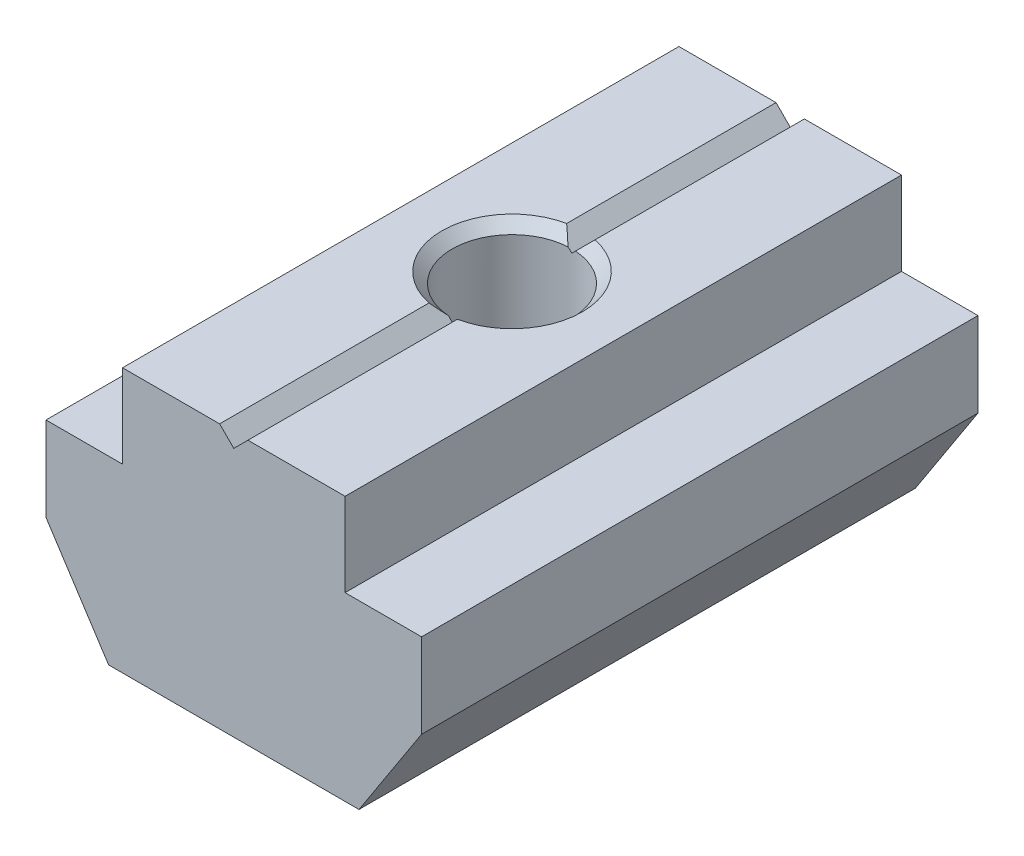
ISO-10303-21;
HEADER;
FILE_DESCRIPTION(('STEP AP214'),'2;1');
FILE_NAME('part.step','',(''),(''),'','','');
FILE_SCHEMA(('AUTOMOTIVE_DESIGN { 1 0 10303 214 1 1 1 1 }'));
ENDSEC;
DATA;
#1=APPLICATION_CONTEXT('core data for automotive mechanical design processes');
#2=APPLICATION_PROTOCOL_DEFINITION('international standard','automotive_design',2000,#1);
#3=PRODUCT_CONTEXT('',#1,'mechanical');
#4=PRODUCT('Part','Part','',(#3));
#5=PRODUCT_RELATED_PRODUCT_CATEGORY('part','',(#4));
#6=PRODUCT_DEFINITION_FORMATION('','',#4);
#7=PRODUCT_DEFINITION_CONTEXT('part definition',#1,'design');
#8=PRODUCT_DEFINITION('design','',#6,#7);
#9=PRODUCT_DEFINITION_SHAPE('','',#8);
#10=(LENGTH_UNIT() NAMED_UNIT(*) SI_UNIT(.MILLI.,.METRE.));
#11=(NAMED_UNIT(*) PLANE_ANGLE_UNIT() SI_UNIT($,.RADIAN.));
#12=(NAMED_UNIT(*) SI_UNIT($,.STERADIAN.) SOLID_ANGLE_UNIT());
#13=UNCERTAINTY_MEASURE_WITH_UNIT(LENGTH_MEASURE(1.E-05),#10,'distance_accuracy_value','');
#14=(GEOMETRIC_REPRESENTATION_CONTEXT(3) GLOBAL_UNCERTAINTY_ASSIGNED_CONTEXT((#13)) GLOBAL_UNIT_ASSIGNED_CONTEXT((#10,
#11,#12)) REPRESENTATION_CONTEXT('',''));
#15=CARTESIAN_POINT('',(0.,0.,0.));
#16=DIRECTION('',(0.,0.,1.));
#17=DIRECTION('',(1.,0.,0.));
#18=AXIS2_PLACEMENT_3D('',#15,#16,#17);
#19=CARTESIAN_POINT('',(4.,9.5,-10.));
#20=DIRECTION('',(0.,1.,0.));
#21=DIRECTION('',(-1.,0.,0.));
#22=AXIS2_PLACEMENT_3D('',#19,#20,#21);
#23=PLANE('',#22);
#24=DIRECTION('',(0.,0.,1.));
#25=VECTOR('',#24,1.);
#26=CARTESIAN_POINT('',(0.509116882454315,9.5,-10.));
#27=LINE('',#26,#25);
#28=CARTESIAN_POINT('',(0.509116882454315,9.5,-10.));
#29=VERTEX_POINT('',#28);
#30=CARTESIAN_POINT('',(0.509116882454315,9.5,-2.47314071577013));
#31=VERTEX_POINT('',#30);
#32=EDGE_CURVE('E236',#29,#31,#27,.T.);
#33=ORIENTED_EDGE('',*,*,#32,.T.);
#34=CARTESIAN_POINT('',(0.,9.5,0.));
#35=DIRECTION('',(0.,1.,0.));
#36=DIRECTION('',(-1.,0.,0.));
#37=AXIS2_PLACEMENT_3D('',#34,#35,#36);
#38=CIRCLE('',#37,2.525);
#39=CARTESIAN_POINT('',(0.509116882454315,9.5,2.47314071577013));
#40=VERTEX_POINT('',#39);
#41=EDGE_CURVE('E333',#31,#40,#38,.F.);
#42=ORIENTED_EDGE('',*,*,#41,.T.);
#43=CARTESIAN_POINT('',(0.509116882454315,9.5,10.));
#44=VERTEX_POINT('',#43);
#45=EDGE_CURVE('E391',#40,#44,#27,.T.);
#46=ORIENTED_EDGE('',*,*,#45,.T.);
#47=DIRECTION('',(-1.,0.,0.));
#48=VECTOR('',#47,1.);
#49=CARTESIAN_POINT('',(4.,9.5,10.));
#50=LINE('',#49,#48);
#51=CARTESIAN_POINT('',(4.,9.5,10.));
#52=VERTEX_POINT('',#51);
#53=EDGE_CURVE('E249',#52,#44,#50,.T.);
#54=ORIENTED_EDGE('',*,*,#53,.F.);
#55=DIRECTION('',(0.,0.,1.));
#56=VECTOR('',#55,1.);
#57=CARTESIAN_POINT('',(4.,9.5,-10.));
#58=LINE('',#57,#56);
#59=CARTESIAN_POINT('',(4.,9.5,-10.));
#60=VERTEX_POINT('',#59);
#61=EDGE_CURVE('E293',#60,#52,#58,.T.);
#62=ORIENTED_EDGE('',*,*,#61,.F.);
#63=DIRECTION('',(-1.,0.,0.));
#64=VECTOR('',#63,1.);
#65=CARTESIAN_POINT('',(4.,9.5,-10.));
#66=LINE('',#65,#64);
#67=EDGE_CURVE('E200',#60,#29,#66,.T.);
#68=ORIENTED_EDGE('',*,*,#67,.T.);
#69=EDGE_LOOP('',(#33,#42,#46,#54,#62,#68));
#70=FACE_BOUND('',#69,.T.);
#71=ADVANCED_FACE('F45',(#70),#23,.T.);
#72=CARTESIAN_POINT('',(4.5,0.,-10.));
#73=DIRECTION('',(0.838670567945425,-0.544639035015025,0.));
#74=DIRECTION('',(0.544639035015025,0.838670567945425,0.));
#75=AXIS2_PLACEMENT_3D('',#72,#73,#74);
#76=PLANE('',#75);
#77=DIRECTION('',(0.544639035015025,0.838670567945425,0.));
#78=VECTOR('',#77,1.);
#79=CARTESIAN_POINT('',(4.5,0.,10.));
#80=LINE('',#79,#78);
#81=CARTESIAN_POINT('',(4.5,0.,10.));
#82=VERTEX_POINT('',#81);
#83=CARTESIAN_POINT('',(6.75,3.46469616858283,10.));
#84=VERTEX_POINT('',#83);
#85=EDGE_CURVE('E231',#82,#84,#80,.T.);
#86=ORIENTED_EDGE('',*,*,#85,.F.);
#87=DIRECTION('',(0.,0.,1.));
#88=VECTOR('',#87,1.);
#89=CARTESIAN_POINT('',(4.5,0.,-10.));
#90=LINE('',#89,#88);
#91=CARTESIAN_POINT('',(4.5,0.,-10.));
#92=VERTEX_POINT('',#91);
#93=EDGE_CURVE('E274',#92,#82,#90,.T.);
#94=ORIENTED_EDGE('',*,*,#93,.F.);
#95=DIRECTION('',(0.544639035015025,0.838670567945425,0.));
#96=VECTOR('',#95,1.);
#97=CARTESIAN_POINT('',(4.5,0.,-10.));
#98=LINE('',#97,#96);
#99=CARTESIAN_POINT('',(6.75,3.46469616858283,-10.));
#100=VERTEX_POINT('',#99);
#101=EDGE_CURVE('E273',#92,#100,#98,.T.);
#102=ORIENTED_EDGE('',*,*,#101,.T.);
#103=DIRECTION('',(0.,0.,1.));
#104=VECTOR('',#103,1.);
#105=CARTESIAN_POINT('',(6.75,3.46469616858283,-10.));
#106=LINE('',#105,#104);
#107=EDGE_CURVE('E230',#100,#84,#106,.T.);
#108=ORIENTED_EDGE('',*,*,#107,.T.);
#109=EDGE_LOOP('',(#86,#94,#102,#108));
#110=FACE_BOUND('',#109,.T.);
#111=ADVANCED_FACE('F412',(#110),#76,.T.);
#112=CARTESIAN_POINT('',(-4.5,0.,-10.));
#113=DIRECTION('',(0.,-1.,0.));
#114=DIRECTION('',(0.,0.,-1.));
#115=AXIS2_PLACEMENT_3D('',#112,#113,#114);
#116=PLANE('',#115);
#117=CARTESIAN_POINT('',(0.,0.,0.));
#118=DIRECTION('',(0.,-1.,0.));
#119=DIRECTION('',(0.,0.,-1.));
#120=AXIS2_PLACEMENT_3D('',#117,#118,#119);
#121=CIRCLE('',#120,2.525);
#122=CARTESIAN_POINT('',(0.,0.,-2.525));
#123=VERTEX_POINT('',#122);
#124=EDGE_CURVE('E11',#123,#123,#121,.F.);
#125=ORIENTED_EDGE('',*,*,#124,.T.);
#126=EDGE_LOOP('',(#125));
#127=FACE_BOUND('',#126,.T.);
#128=DIRECTION('',(1.,0.,0.));
#129=VECTOR('',#128,1.);
#130=CARTESIAN_POINT('',(-4.5,0.,10.));
#131=LINE('',#130,#129);
#132=CARTESIAN_POINT('',(-4.5,0.,10.));
#133=VERTEX_POINT('',#132);
#134=EDGE_CURVE('E269',#133,#82,#131,.T.);
#135=ORIENTED_EDGE('',*,*,#134,.F.);
#136=DIRECTION('',(0.,0.,1.));
#137=VECTOR('',#136,1.);
#138=CARTESIAN_POINT('',(-4.5,0.,-10.));
#139=LINE('',#138,#137);
#140=CARTESIAN_POINT('',(-4.5,0.,-10.));
#141=VERTEX_POINT('',#140);
#142=EDGE_CURVE('E278',#141,#133,#139,.T.);
#143=ORIENTED_EDGE('',*,*,#142,.F.);
#144=DIRECTION('',(1.,0.,0.));
#145=VECTOR('',#144,1.);
#146=CARTESIAN_POINT('',(-4.5,0.,-10.));
#147=LINE('',#146,#145);
#148=EDGE_CURVE('E226',#141,#92,#147,.T.);
#149=ORIENTED_EDGE('',*,*,#148,.T.);
#150=ORIENTED_EDGE('',*,*,#93,.T.);
#151=EDGE_LOOP('',(#135,#143,#149,#150));
#152=FACE_BOUND('',#151,.T.);
#153=ADVANCED_FACE('F417',(#127,#152),#116,.T.);
#154=CARTESIAN_POINT('',(-6.75,3.46469616858283,-10.));
#155=DIRECTION('',(-0.838670567945425,-0.544639035015025,0.));
#156=DIRECTION('',(0.544639035015025,-0.838670567945425,0.));
#157=AXIS2_PLACEMENT_3D('',#154,#155,#156);
#158=PLANE('',#157);
#159=DIRECTION('',(0.544639035015025,-0.838670567945425,0.));
#160=VECTOR('',#159,1.);
#161=CARTESIAN_POINT('',(-6.75,3.46469616858283,10.));
#162=LINE('',#161,#160);
#163=CARTESIAN_POINT('',(-6.75,3.46469616858283,10.));
#164=VERTEX_POINT('',#163);
#165=EDGE_CURVE('E265',#164,#133,#162,.T.);
#166=ORIENTED_EDGE('',*,*,#165,.F.);
#167=DIRECTION('',(0.,0.,1.));
#168=VECTOR('',#167,1.);
#169=CARTESIAN_POINT('',(-6.75,3.46469616858283,-10.));
#170=LINE('',#169,#168);
#171=CARTESIAN_POINT('',(-6.75,3.46469616858283,-10.));
#172=VERTEX_POINT('',#171);
#173=EDGE_CURVE('E281',#172,#164,#170,.T.);
#174=ORIENTED_EDGE('',*,*,#173,.F.);
#175=DIRECTION('',(0.544639035015025,-0.838670567945425,0.));
#176=VECTOR('',#175,1.);
#177=CARTESIAN_POINT('',(-6.75,3.46469616858283,-10.));
#178=LINE('',#177,#176);
#179=EDGE_CURVE('E222',#172,#141,#178,.T.);
#180=ORIENTED_EDGE('',*,*,#179,.T.);
#181=ORIENTED_EDGE('',*,*,#142,.T.);
#182=EDGE_LOOP('',(#166,#174,#180,#181));
#183=FACE_BOUND('',#182,.T.);
#184=ADVANCED_FACE('F420',(#183),#158,.T.);
#185=CARTESIAN_POINT('',(-6.75,6.5,-10.));
#186=DIRECTION('',(-1.,0.,0.));
#187=DIRECTION('',(0.,0.,1.));
#188=AXIS2_PLACEMENT_3D('',#185,#186,#187);
#189=PLANE('',#188);
#190=DIRECTION('',(0.,-1.,0.));
#191=VECTOR('',#190,1.);
#192=CARTESIAN_POINT('',(-6.75,6.5,10.));
#193=LINE('',#192,#191);
#194=CARTESIAN_POINT('',(-6.75,6.5,10.));
#195=VERTEX_POINT('',#194);
#196=EDGE_CURVE('E261',#195,#164,#193,.T.);
#197=ORIENTED_EDGE('',*,*,#196,.F.);
#198=DIRECTION('',(0.,0.,1.));
#199=VECTOR('',#198,1.);
#200=CARTESIAN_POINT('',(-6.75,6.5,-10.));
#201=LINE('',#200,#199);
#202=CARTESIAN_POINT('',(-6.75,6.5,-10.));
#203=VERTEX_POINT('',#202);
#204=EDGE_CURVE('E284',#203,#195,#201,.T.);
#205=ORIENTED_EDGE('',*,*,#204,.F.);
#206=DIRECTION('',(0.,-1.,0.));
#207=VECTOR('',#206,1.);
#208=CARTESIAN_POINT('',(-6.75,6.5,-10.));
#209=LINE('',#208,#207);
#210=EDGE_CURVE('E218',#203,#172,#209,.T.);
#211=ORIENTED_EDGE('',*,*,#210,.T.);
#212=ORIENTED_EDGE('',*,*,#173,.T.);
#213=EDGE_LOOP('',(#197,#205,#211,#212));
#214=FACE_BOUND('',#213,.T.);
#215=ADVANCED_FACE('F424',(#214),#189,.T.);
#216=CARTESIAN_POINT('',(-4.,6.5,-10.));
#217=DIRECTION('',(0.,1.,0.));
#218=DIRECTION('',(-1.,0.,0.));
#219=AXIS2_PLACEMENT_3D('',#216,#217,#218);
#220=PLANE('',#219);
#221=DIRECTION('',(-1.,0.,0.));
#222=VECTOR('',#221,1.);
#223=CARTESIAN_POINT('',(-4.,6.5,10.));
#224=LINE('',#223,#222);
#225=CARTESIAN_POINT('',(-4.,6.5,10.));
#226=VERTEX_POINT('',#225);
#227=EDGE_CURVE('E257',#226,#195,#224,.T.);
#228=ORIENTED_EDGE('',*,*,#227,.F.);
#229=DIRECTION('',(0.,0.,1.));
#230=VECTOR('',#229,1.);
#231=CARTESIAN_POINT('',(-4.,6.5,-10.));
#232=LINE('',#231,#230);
#233=CARTESIAN_POINT('',(-4.,6.5,-10.));
#234=VERTEX_POINT('',#233);
#235=EDGE_CURVE('E287',#234,#226,#232,.T.);
#236=ORIENTED_EDGE('',*,*,#235,.F.);
#237=DIRECTION('',(-1.,0.,0.));
#238=VECTOR('',#237,1.);
#239=CARTESIAN_POINT('',(-4.,6.5,-10.));
#240=LINE('',#239,#238);
#241=EDGE_CURVE('E214',#234,#203,#240,.T.);
#242=ORIENTED_EDGE('',*,*,#241,.T.);
#243=ORIENTED_EDGE('',*,*,#204,.T.);
#244=EDGE_LOOP('',(#228,#236,#242,#243));
#245=FACE_BOUND('',#244,.T.);
#246=ADVANCED_FACE('F427',(#245),#220,.T.);
#247=CARTESIAN_POINT('',(-4.,9.5,-10.));
#248=DIRECTION('',(-1.,0.,0.));
#249=DIRECTION('',(0.,0.,1.));
#250=AXIS2_PLACEMENT_3D('',#247,#248,#249);
#251=PLANE('',#250);
#252=DIRECTION('',(0.,-1.,0.));
#253=VECTOR('',#252,1.);
#254=CARTESIAN_POINT('',(-4.,9.5,10.));
#255=LINE('',#254,#253);
#256=CARTESIAN_POINT('',(-4.,9.5,10.));
#257=VERTEX_POINT('',#256);
#258=EDGE_CURVE('E253',#257,#226,#255,.T.);
#259=ORIENTED_EDGE('',*,*,#258,.F.);
#260=DIRECTION('',(0.,0.,1.));
#261=VECTOR('',#260,1.);
#262=CARTESIAN_POINT('',(-4.,9.5,-10.));
#263=LINE('',#262,#261);
#264=CARTESIAN_POINT('',(-4.,9.5,-10.));
#265=VERTEX_POINT('',#264);
#266=EDGE_CURVE('E290',#265,#257,#263,.T.);
#267=ORIENTED_EDGE('',*,*,#266,.F.);
#268=DIRECTION('',(0.,-1.,0.));
#269=VECTOR('',#268,1.);
#270=CARTESIAN_POINT('',(-4.,9.5,-10.));
#271=LINE('',#270,#269);
#272=EDGE_CURVE('E198',#265,#234,#271,.T.);
#273=ORIENTED_EDGE('',*,*,#272,.T.);
#274=ORIENTED_EDGE('',*,*,#235,.T.);
#275=EDGE_LOOP('',(#259,#267,#273,#274));
#276=FACE_BOUND('',#275,.T.);
#277=ADVANCED_FACE('F430',(#276),#251,.T.);
#278=DIRECTION('',(0.,0.,1.));
#279=VECTOR('',#278,1.);
#280=CARTESIAN_POINT('',(-0.509116882454313,9.5,-10.));
#281=LINE('',#280,#279);
#282=CARTESIAN_POINT('',(-0.509116882454313,9.5,2.47314071577013));
#283=VERTEX_POINT('',#282);
#284=CARTESIAN_POINT('',(-0.509116882454313,9.5,10.));
#285=VERTEX_POINT('',#284);
#286=EDGE_CURVE('E192',#283,#285,#281,.T.);
#287=ORIENTED_EDGE('',*,*,#286,.F.);
#288=CARTESIAN_POINT('',(0.,9.5,0.));
#289=DIRECTION('',(0.,1.,0.));
#290=DIRECTION('',(-1.,0.,0.));
#291=AXIS2_PLACEMENT_3D('',#288,#289,#290);
#292=CIRCLE('',#291,2.525);
#293=CARTESIAN_POINT('',(-0.509116882454313,9.5,-2.47314071577013));
#294=VERTEX_POINT('',#293);
#295=EDGE_CURVE('E61',#283,#294,#292,.F.);
#296=ORIENTED_EDGE('',*,*,#295,.T.);
#297=CARTESIAN_POINT('',(-0.509116882454313,9.5,-10.));
#298=VERTEX_POINT('',#297);
#299=EDGE_CURVE('E173',#298,#294,#281,.T.);
#300=ORIENTED_EDGE('',*,*,#299,.F.);
#301=EDGE_CURVE('E188',#298,#265,#66,.T.);
#302=ORIENTED_EDGE('',*,*,#301,.T.);
#303=ORIENTED_EDGE('',*,*,#266,.T.);
#304=EDGE_CURVE('E248',#285,#257,#50,.T.);
#305=ORIENTED_EDGE('',*,*,#304,.F.);
#306=EDGE_LOOP('',(#287,#296,#300,#302,#303,#305));
#307=FACE_BOUND('',#306,.T.);
#308=ADVANCED_FACE('F186',(#307),#23,.T.);
#309=CARTESIAN_POINT('',(4.,6.5,-10.));
#310=DIRECTION('',(1.,0.,0.));
#311=DIRECTION('',(0.,0.,-1.));
#312=AXIS2_PLACEMENT_3D('',#309,#310,#311);
#313=PLANE('',#312);
#314=DIRECTION('',(0.,1.,0.));
#315=VECTOR('',#314,1.);
#316=CARTESIAN_POINT('',(4.,6.5,10.));
#317=LINE('',#316,#315);
#318=CARTESIAN_POINT('',(4.,6.5,10.));
#319=VERTEX_POINT('',#318);
#320=EDGE_CURVE('E244',#319,#52,#317,.T.);
#321=ORIENTED_EDGE('',*,*,#320,.F.);
#322=DIRECTION('',(0.,0.,1.));
#323=VECTOR('',#322,1.);
#324=CARTESIAN_POINT('',(4.,6.5,-10.));
#325=LINE('',#324,#323);
#326=CARTESIAN_POINT('',(4.,6.5,-10.));
#327=VERTEX_POINT('',#326);
#328=EDGE_CURVE('E296',#327,#319,#325,.T.);
#329=ORIENTED_EDGE('',*,*,#328,.F.);
#330=DIRECTION('',(0.,1.,0.));
#331=VECTOR('',#330,1.);
#332=CARTESIAN_POINT('',(4.,6.5,-10.));
#333=LINE('',#332,#331);
#334=EDGE_CURVE('E201',#327,#60,#333,.T.);
#335=ORIENTED_EDGE('',*,*,#334,.T.);
#336=ORIENTED_EDGE('',*,*,#61,.T.);
#337=EDGE_LOOP('',(#321,#329,#335,#336));
#338=FACE_BOUND('',#337,.T.);
#339=ADVANCED_FACE('F455',(#338),#313,.T.);
#340=CARTESIAN_POINT('',(6.75,6.5,-10.));
#341=DIRECTION('',(0.,1.,0.));
#342=DIRECTION('',(-1.,0.,0.));
#343=AXIS2_PLACEMENT_3D('',#340,#341,#342);
#344=PLANE('',#343);
#345=DIRECTION('',(-1.,0.,0.));
#346=VECTOR('',#345,1.);
#347=CARTESIAN_POINT('',(6.75,6.5,10.));
#348=LINE('',#347,#346);
#349=CARTESIAN_POINT('',(6.75,6.5,10.));
#350=VERTEX_POINT('',#349);
#351=EDGE_CURVE('E240',#350,#319,#348,.T.);
#352=ORIENTED_EDGE('',*,*,#351,.F.);
#353=DIRECTION('',(0.,0.,1.));
#354=VECTOR('',#353,1.);
#355=CARTESIAN_POINT('',(6.75,6.5,-10.));
#356=LINE('',#355,#354);
#357=CARTESIAN_POINT('',(6.75,6.5,-10.));
#358=VERTEX_POINT('',#357);
#359=EDGE_CURVE('E299',#358,#350,#356,.T.);
#360=ORIENTED_EDGE('',*,*,#359,.F.);
#361=DIRECTION('',(-1.,0.,0.));
#362=VECTOR('',#361,1.);
#363=CARTESIAN_POINT('',(6.75,6.5,-10.));
#364=LINE('',#363,#362);
#365=EDGE_CURVE('E208',#358,#327,#364,.T.);
#366=ORIENTED_EDGE('',*,*,#365,.T.);
#367=ORIENTED_EDGE('',*,*,#328,.T.);
#368=EDGE_LOOP('',(#352,#360,#366,#367));
#369=FACE_BOUND('',#368,.T.);
#370=ADVANCED_FACE('F401',(#369),#344,.T.);
#371=CARTESIAN_POINT('',(6.75,3.46469616858283,-10.));
#372=DIRECTION('',(1.,0.,0.));
#373=DIRECTION('',(0.,0.,-1.));
#374=AXIS2_PLACEMENT_3D('',#371,#372,#373);
#375=PLANE('',#374);
#376=DIRECTION('',(0.,1.,0.));
#377=VECTOR('',#376,1.);
#378=CARTESIAN_POINT('',(6.75,3.46469616858283,10.));
#379=LINE('',#378,#377);
#380=EDGE_CURVE('E235',#84,#350,#379,.T.);
#381=ORIENTED_EDGE('',*,*,#380,.F.);
#382=ORIENTED_EDGE('',*,*,#107,.F.);
#383=DIRECTION('',(0.,1.,0.));
#384=VECTOR('',#383,1.);
#385=CARTESIAN_POINT('',(6.75,3.46469616858283,-10.));
#386=LINE('',#385,#384);
#387=EDGE_CURVE('E375',#100,#358,#386,.T.);
#388=ORIENTED_EDGE('',*,*,#387,.T.);
#389=ORIENTED_EDGE('',*,*,#359,.T.);
#390=EDGE_LOOP('',(#381,#382,#388,#389));
#391=FACE_BOUND('',#390,.T.);
#392=ADVANCED_FACE('F409',(#391),#375,.T.);
#393=CARTESIAN_POINT('',(0.,0.,-10.));
#394=DIRECTION('',(0.,0.,-1.));
#395=DIRECTION('',(-1.,0.,0.));
#396=AXIS2_PLACEMENT_3D('',#393,#394,#395);
#397=PLANE('',#396);
#398=DIRECTION('',(0.707106781186547,0.707106781186548,0.));
#399=VECTOR('',#398,1.);
#400=CARTESIAN_POINT('',(0.,8.99088311754569,-10.));
#401=LINE('',#400,#399);
#402=CARTESIAN_POINT('',(0.,8.99088311754569,-10.));
#403=VERTEX_POINT('',#402);
#404=EDGE_CURVE('E183',#403,#29,#401,.T.);
#405=ORIENTED_EDGE('',*,*,#404,.T.);
#406=ORIENTED_EDGE('',*,*,#67,.F.);
#407=ORIENTED_EDGE('',*,*,#334,.F.);
#408=ORIENTED_EDGE('',*,*,#365,.F.);
#409=ORIENTED_EDGE('',*,*,#387,.F.);
#410=ORIENTED_EDGE('',*,*,#101,.F.);
#411=ORIENTED_EDGE('',*,*,#148,.F.);
#412=ORIENTED_EDGE('',*,*,#179,.F.);
#413=ORIENTED_EDGE('',*,*,#210,.F.);
#414=ORIENTED_EDGE('',*,*,#241,.F.);
#415=ORIENTED_EDGE('',*,*,#272,.F.);
#416=ORIENTED_EDGE('',*,*,#301,.F.);
#417=DIRECTION('',(0.707106781186547,-0.707106781186548,0.));
#418=VECTOR('',#417,1.);
#419=CARTESIAN_POINT('',(-0.509116882454313,9.5,-10.));
#420=LINE('',#419,#418);
#421=EDGE_CURVE('E171',#298,#403,#420,.T.);
#422=ORIENTED_EDGE('',*,*,#421,.T.);
#423=EDGE_LOOP('',(#405,#406,#407,#408,#409,#410,#411,#412,#413,#414,#415,#416,#422));
#424=FACE_BOUND('',#423,.T.);
#425=ADVANCED_FACE('F195',(#424),#397,.T.);
#426=CARTESIAN_POINT('',(0.,0.,10.));
#427=DIRECTION('',(0.,0.,-1.));
#428=DIRECTION('',(-1.,0.,0.));
#429=AXIS2_PLACEMENT_3D('',#426,#427,#428);
#430=PLANE('',#429);
#431=ORIENTED_EDGE('',*,*,#53,.T.);
#432=DIRECTION('',(0.707106781186547,0.707106781186548,0.));
#433=VECTOR('',#432,1.);
#434=CARTESIAN_POINT('',(0.,8.99088311754569,10.));
#435=LINE('',#434,#433);
#436=CARTESIAN_POINT('',(0.,8.99088311754569,10.));
#437=VERTEX_POINT('',#436);
#438=EDGE_CURVE('E184',#437,#44,#435,.T.);
#439=ORIENTED_EDGE('',*,*,#438,.F.);
#440=DIRECTION('',(0.707106781186547,-0.707106781186548,0.));
#441=VECTOR('',#440,1.);
#442=CARTESIAN_POINT('',(-0.509116882454313,9.5,10.));
#443=LINE('',#442,#441);
#444=EDGE_CURVE('E377',#285,#437,#443,.T.);
#445=ORIENTED_EDGE('',*,*,#444,.F.);
#446=ORIENTED_EDGE('',*,*,#304,.T.);
#447=ORIENTED_EDGE('',*,*,#258,.T.);
#448=ORIENTED_EDGE('',*,*,#227,.T.);
#449=ORIENTED_EDGE('',*,*,#196,.T.);
#450=ORIENTED_EDGE('',*,*,#165,.T.);
#451=ORIENTED_EDGE('',*,*,#134,.T.);
#452=ORIENTED_EDGE('',*,*,#85,.T.);
#453=ORIENTED_EDGE('',*,*,#380,.T.);
#454=ORIENTED_EDGE('',*,*,#351,.T.);
#455=ORIENTED_EDGE('',*,*,#320,.T.);
#456=EDGE_LOOP('',(#431,#439,#445,#446,#447,#448,#449,#450,#451,#452,#453,#454,#455));
#457=FACE_BOUND('',#456,.T.);
#458=ADVANCED_FACE('F439',(#457),#430,.F.);
#459=CARTESIAN_POINT('',(0.,0.,0.));
#460=DIRECTION('',(0.,1.,0.));
#461=DIRECTION('',(-1.,0.,0.));
#462=AXIS2_PLACEMENT_3D('',#459,#460,#461);
#463=CYLINDRICAL_SURFACE('',#462,2.15);
#464=CARTESIAN_POINT('',(0.,0.374999999999996,0.));
#465=DIRECTION('',(0.,-1.,0.));
#466=DIRECTION('',(1.,0.,0.));
#467=AXIS2_PLACEMENT_3D('',#464,#465,#466);
#468=CIRCLE('',#467,2.15);
#469=CARTESIAN_POINT('',(2.15,0.374999999999997,0.));
#470=VERTEX_POINT('',#469);
#471=EDGE_CURVE('E312',#470,#470,#468,.T.);
#472=ORIENTED_EDGE('',*,*,#471,.T.);
#473=EDGE_LOOP('',(#472));
#474=FACE_BOUND('',#473,.T.);
#475=CARTESIAN_POINT('',(0.,8.99088311754568,0.));
#476=DIRECTION('',(0.707106781186548,-0.707106781186547,0.));
#477=DIRECTION('',(0.707106781186547,0.707106781186548,0.));
#478=AXIS2_PLACEMENT_3D('',#475,#476,#477);
#479=ELLIPSE('',#478,3.04055915910216,2.15);
#480=CARTESIAN_POINT('',(0.,8.99088311754569,2.15));
#481=VERTEX_POINT('',#480);
#482=CARTESIAN_POINT('',(0.134116882454314,9.125,2.14581282078394));
#483=VERTEX_POINT('',#482);
#484=EDGE_CURVE('E311',#481,#483,#479,.F.);
#485=ORIENTED_EDGE('',*,*,#484,.T.);
#486=CARTESIAN_POINT('',(0.,9.125,0.));
#487=DIRECTION('',(0.,1.,0.));
#488=DIRECTION('',(-1.,0.,0.));
#489=AXIS2_PLACEMENT_3D('',#486,#487,#488);
#490=CIRCLE('',#489,2.15);
#491=CARTESIAN_POINT('',(0.134116882454314,9.125,-2.14581282078394));
#492=VERTEX_POINT('',#491);
#493=EDGE_CURVE('E320',#483,#492,#490,.T.);
#494=ORIENTED_EDGE('',*,*,#493,.T.);
#495=CARTESIAN_POINT('',(0.,8.99088311754569,-2.15));
#496=VERTEX_POINT('',#495);
#497=EDGE_CURVE('E307',#492,#496,#479,.F.);
#498=ORIENTED_EDGE('',*,*,#497,.T.);
#499=CARTESIAN_POINT('',(0.,8.99088311754569,0.));
#500=DIRECTION('',(-0.707106781186548,-0.707106781186547,0.));
#501=DIRECTION('',(-0.707106781186547,0.707106781186548,0.));
#502=AXIS2_PLACEMENT_3D('',#499,#500,#501);
#503=ELLIPSE('',#502,3.04055915910216,2.15);
#504=CARTESIAN_POINT('',(-0.134116882454313,9.125,-2.14581282078394));
#505=VERTEX_POINT('',#504);
#506=EDGE_CURVE('E277',#496,#505,#503,.F.);
#507=ORIENTED_EDGE('',*,*,#506,.T.);
#508=CARTESIAN_POINT('',(0.,9.125,0.));
#509=DIRECTION('',(0.,1.,0.));
#510=DIRECTION('',(-1.,0.,0.));
#511=AXIS2_PLACEMENT_3D('',#508,#509,#510);
#512=CIRCLE('',#511,2.15);
#513=CARTESIAN_POINT('',(-0.134116882454313,9.125,2.14581282078394));
#514=VERTEX_POINT('',#513);
#515=EDGE_CURVE('E316',#505,#514,#512,.T.);
#516=ORIENTED_EDGE('',*,*,#515,.T.);
#517=EDGE_CURVE('E308',#514,#481,#503,.F.);
#518=ORIENTED_EDGE('',*,*,#517,.T.);
#519=EDGE_LOOP('',(#485,#494,#498,#507,#516,#518));
#520=FACE_BOUND('',#519,.T.);
#521=ADVANCED_FACE('F449',(#474,#520),#463,.F.);
#522=CARTESIAN_POINT('',(-0.509116882454313,9.5,-10.));
#523=DIRECTION('',(-0.707106781186548,-0.707106781186547,0.));
#524=DIRECTION('',(0.707106781186547,-0.707106781186548,0.));
#525=AXIS2_PLACEMENT_3D('',#522,#523,#524);
#526=PLANE('',#525);
#527=ORIENTED_EDGE('',*,*,#299,.T.);
#528=CARTESIAN_POINT('',(-0.509116882454313,9.5,-2.47314071577013));
#529=CARTESIAN_POINT('',(-0.477292390154802,9.46817550770049,-2.44719908113499));
#530=CARTESIAN_POINT('',(-0.445591551700827,9.43647466924652,-2.42095239021074));
#531=CARTESIAN_POINT('',(-0.382473047894031,9.37335616543972,-2.36781204005094));
#532=CARTESIAN_POINT('',(-0.351055313579388,9.34193843112508,-2.34091854456794));
#533=CARTESIAN_POINT('',(-0.288521347638149,9.27940446518384,-2.2864334140952));
#534=CARTESIAN_POINT('',(-0.257405131131995,9.24828824867768,-2.25884174434159));
#535=CARTESIAN_POINT('',(-0.195502732414762,9.18638584996045,-2.20290412980677));
#536=CARTESIAN_POINT('',(-0.164716634909191,9.15559975245488,-2.174557997641));
#537=CARTESIAN_POINT('',(-0.134116882454313,9.125,-2.14581282078394));
#538=B_SPLINE_CURVE_WITH_KNOTS('',3,(#528,#529,#530,#531,#532,#533,#534,#535,#536,#537),
.UNSPECIFIED.,.F.,.F.,(4,2,2,2,4),(0.,0.155843143997325,0.311647239844359,0.467459108897528,
0.623310044602721),.UNSPECIFIED.);
#539=EDGE_CURVE('E54',#294,#505,#538,.T.);
#540=ORIENTED_EDGE('',*,*,#539,.T.);
#541=ORIENTED_EDGE('',*,*,#506,.F.);
#542=DIRECTION('',(0.,0.,1.));
#543=VECTOR('',#542,1.);
#544=CARTESIAN_POINT('',(0.,8.99088311754569,-10.));
#545=LINE('',#544,#543);
#546=EDGE_CURVE('E177',#403,#496,#545,.T.);
#547=ORIENTED_EDGE('',*,*,#546,.F.);
#548=ORIENTED_EDGE('',*,*,#421,.F.);
#549=EDGE_LOOP('',(#527,#540,#541,#547,#548));
#550=FACE_BOUND('',#549,.T.);
#551=ADVANCED_FACE('F172',(#550),#526,.F.);
#552=CARTESIAN_POINT('',(0.,8.99088311754569,-10.));
#553=DIRECTION('',(0.707106781186548,-0.707106781186547,0.));
#554=DIRECTION('',(0.707106781186547,0.707106781186548,0.));
#555=AXIS2_PLACEMENT_3D('',#552,#553,#554);
#556=PLANE('',#555);
#557=ORIENTED_EDGE('',*,*,#497,.F.);
#558=CARTESIAN_POINT('',(0.134116882454314,9.125,-2.14581282078394));
#559=CARTESIAN_POINT('',(0.164716634909192,9.15559975245488,-2.174557997641));
#560=CARTESIAN_POINT('',(0.195502732414763,9.18638584996045,-2.20290412980677));
#561=CARTESIAN_POINT('',(0.257405131131996,9.24828824867768,-2.2588417443416));
#562=CARTESIAN_POINT('',(0.28852134763815,9.27940446518384,-2.2864334140952));
#563=CARTESIAN_POINT('',(0.351055313579389,9.34193843112508,-2.34091854456794));
#564=CARTESIAN_POINT('',(0.382473047894033,9.37335616543972,-2.36781204005094));
#565=CARTESIAN_POINT('',(0.445591551700829,9.43647466924652,-2.42095239021074));
#566=CARTESIAN_POINT('',(0.477292390154804,9.46817550770049,-2.44719908113499));
#567=CARTESIAN_POINT('',(0.509116882454315,9.5,-2.47314071577014));
#568=B_SPLINE_CURVE_WITH_KNOTS('',3,(#558,#559,#560,#561,#562,#563,#564,#565,#566,#567),
.UNSPECIFIED.,.F.,.F.,(4,2,2,2,4),(0.,0.155850935705194,0.311662804758364,0.467466900605398,
0.623310044602725),.UNSPECIFIED.);
#569=EDGE_CURVE('E324',#492,#31,#568,.T.);
#570=ORIENTED_EDGE('',*,*,#569,.T.);
#571=ORIENTED_EDGE('',*,*,#32,.F.);
#572=ORIENTED_EDGE('',*,*,#404,.F.);
#573=ORIENTED_EDGE('',*,*,#546,.T.);
#574=EDGE_LOOP('',(#557,#570,#571,#572,#573));
#575=FACE_BOUND('',#574,.T.);
#576=ADVANCED_FACE('F338',(#575),#556,.F.);
#577=ORIENTED_EDGE('',*,*,#45,.F.);
#578=CARTESIAN_POINT('',(0.509116882454315,9.5,2.47314071577014));
#579=CARTESIAN_POINT('',(0.477292390154804,9.46817550770049,2.44719908113499));
#580=CARTESIAN_POINT('',(0.445591551700829,9.43647466924652,2.42095239021074));
#581=CARTESIAN_POINT('',(0.382473047894032,9.37335616543972,2.36781204005094));
#582=CARTESIAN_POINT('',(0.351055313579389,9.34193843112508,2.34091854456794));
#583=CARTESIAN_POINT('',(0.28852134763815,9.27940446518384,2.2864334140952));
#584=CARTESIAN_POINT('',(0.257405131131996,9.24828824867768,2.2588417443416));
#585=CARTESIAN_POINT('',(0.195502732414763,9.18638584996045,2.20290412980677));
#586=CARTESIAN_POINT('',(0.164716634909191,9.15559975245488,2.174557997641));
#587=CARTESIAN_POINT('',(0.134116882454314,9.125,2.14581282078394));
#588=B_SPLINE_CURVE_WITH_KNOTS('',3,(#578,#579,#580,#581,#582,#583,#584,#585,#586,#587),
.UNSPECIFIED.,.F.,.F.,(4,2,2,2,4),(0.,0.155843143997327,0.311647239844361,0.467459108897529,
0.623310044602724),.UNSPECIFIED.);
#589=EDGE_CURVE('E348',#40,#483,#588,.T.);
#590=ORIENTED_EDGE('',*,*,#589,.T.);
#591=ORIENTED_EDGE('',*,*,#484,.F.);
#592=EDGE_CURVE('E191',#481,#437,#545,.T.);
#593=ORIENTED_EDGE('',*,*,#592,.T.);
#594=ORIENTED_EDGE('',*,*,#438,.T.);
#595=EDGE_LOOP('',(#577,#590,#591,#593,#594));
#596=FACE_BOUND('',#595,.T.);
#597=ADVANCED_FACE('F342',(#596),#556,.F.);
#598=ORIENTED_EDGE('',*,*,#517,.F.);
#599=CARTESIAN_POINT('',(-0.134116882454313,9.125,2.14581282078394));
#600=CARTESIAN_POINT('',(-0.164716634909191,9.15559975245488,2.174557997641));
#601=CARTESIAN_POINT('',(-0.195502732414762,9.18638584996045,2.20290412980677));
#602=CARTESIAN_POINT('',(-0.257405131131994,9.24828824867768,2.25884174434159));
#603=CARTESIAN_POINT('',(-0.288521347638149,9.27940446518384,2.2864334140952));
#604=CARTESIAN_POINT('',(-0.351055313579387,9.34193843112507,2.34091854456794));
#605=CARTESIAN_POINT('',(-0.38247304789403,9.37335616543972,2.36781204005094));
#606=CARTESIAN_POINT('',(-0.445591551700827,9.43647466924651,2.42095239021074));
#607=CARTESIAN_POINT('',(-0.477292390154802,9.46817550770049,2.44719908113499));
#608=CARTESIAN_POINT('',(-0.509116882454312,9.5,2.47314071577013));
#609=B_SPLINE_CURVE_WITH_KNOTS('',3,(#599,#600,#601,#602,#603,#604,#605,#606,#607,#608),
.UNSPECIFIED.,.F.,.F.,(4,2,2,2,4),(0.,0.155850935705193,0.311662804758361,0.467466900605394,
0.62331004460272),.UNSPECIFIED.);
#610=EDGE_CURVE('E69',#514,#283,#609,.T.);
#611=ORIENTED_EDGE('',*,*,#610,.T.);
#612=ORIENTED_EDGE('',*,*,#286,.T.);
#613=ORIENTED_EDGE('',*,*,#444,.T.);
#614=ORIENTED_EDGE('',*,*,#592,.F.);
#615=EDGE_LOOP('',(#598,#611,#612,#613,#614));
#616=FACE_BOUND('',#615,.T.);
#617=ADVANCED_FACE('F344',(#616),#526,.F.);
#618=CARTESIAN_POINT('',(0.,9.125,0.));
#619=DIRECTION('',(0.,1.,0.));
#620=DIRECTION('',(-1.,0.,0.));
#621=AXIS2_PLACEMENT_3D('',#618,#619,#620);
#622=CONICAL_SURFACE('',#621,2.15,0.785398163397451);
#623=ORIENTED_EDGE('',*,*,#589,.F.);
#624=ORIENTED_EDGE('',*,*,#41,.F.);
#625=ORIENTED_EDGE('',*,*,#569,.F.);
#626=ORIENTED_EDGE('',*,*,#493,.F.);
#627=EDGE_LOOP('',(#623,#624,#625,#626));
#628=FACE_BOUND('',#627,.T.);
#629=ADVANCED_FACE('F335',(#628),#622,.F.);
#630=CARTESIAN_POINT('',(0.,9.125,0.));
#631=DIRECTION('',(0.,1.,0.));
#632=DIRECTION('',(-1.,0.,0.));
#633=AXIS2_PLACEMENT_3D('',#630,#631,#632);
#634=CONICAL_SURFACE('',#633,2.15,0.78539816339745);
#635=ORIENTED_EDGE('',*,*,#539,.F.);
#636=ORIENTED_EDGE('',*,*,#295,.F.);
#637=ORIENTED_EDGE('',*,*,#610,.F.);
#638=ORIENTED_EDGE('',*,*,#515,.F.);
#639=EDGE_LOOP('',(#635,#636,#637,#638));
#640=FACE_BOUND('',#639,.T.);
#641=ADVANCED_FACE('F361',(#640),#634,.F.);
#642=CARTESIAN_POINT('',(0.,0.,0.));
#643=DIRECTION('',(0.,-1.,0.));
#644=DIRECTION('',(1.,0.,0.));
#645=AXIS2_PLACEMENT_3D('',#642,#643,#644);
#646=CONICAL_SURFACE('',#645,2.525,0.78539816339745);
#647=ORIENTED_EDGE('',*,*,#471,.F.);
#648=EDGE_LOOP('',(#647));
#649=FACE_BOUND('',#648,.T.);
#650=ORIENTED_EDGE('',*,*,#124,.F.);
#651=EDGE_LOOP('',(#650));
#652=FACE_BOUND('',#651,.T.);
#653=ADVANCED_FACE('F47',(#649,#652),#646,.F.);
#654=CLOSED_SHELL('',(#71,#111,#153,#184,#215,#246,#277,#308,#339,#370,#392,#425,#458,#521,#551,
#576,#597,#617,#629,#641,#653));
#655=MANIFOLD_SOLID_BREP('B2',#654);
#656=ADVANCED_BREP_SHAPE_REPRESENTATION('',(#18,#655),#14);
#657=SHAPE_DEFINITION_REPRESENTATION(#9,#656);
ENDSEC;
END-ISO-10303-21;
